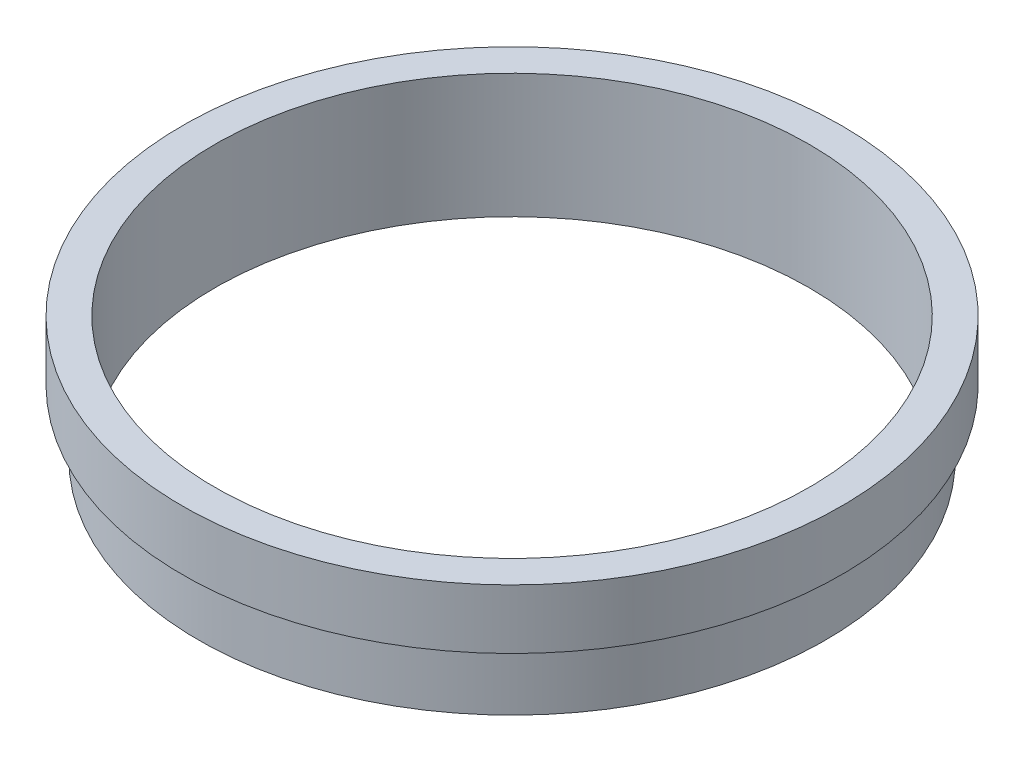
ISO-10303-21;
HEADER;
FILE_DESCRIPTION(('STEP AP214'),'2;1');
FILE_NAME('part.step','',(''),(''),'','','');
FILE_SCHEMA(('AUTOMOTIVE_DESIGN { 1 0 10303 214 1 1 1 1 }'));
ENDSEC;
DATA;
#1=APPLICATION_CONTEXT('core data for automotive mechanical design processes');
#2=APPLICATION_PROTOCOL_DEFINITION('international standard','automotive_design',2000,#1);
#3=PRODUCT_CONTEXT('',#1,'mechanical');
#4=PRODUCT('Part','Part','',(#3));
#5=PRODUCT_RELATED_PRODUCT_CATEGORY('part','',(#4));
#6=PRODUCT_DEFINITION_FORMATION('','',#4);
#7=PRODUCT_DEFINITION_CONTEXT('part definition',#1,'design');
#8=PRODUCT_DEFINITION('design','',#6,#7);
#9=PRODUCT_DEFINITION_SHAPE('','',#8);
#10=(LENGTH_UNIT() NAMED_UNIT(*) SI_UNIT(.MILLI.,.METRE.));
#11=(NAMED_UNIT(*) PLANE_ANGLE_UNIT() SI_UNIT($,.RADIAN.));
#12=(NAMED_UNIT(*) SI_UNIT($,.STERADIAN.) SOLID_ANGLE_UNIT());
#13=UNCERTAINTY_MEASURE_WITH_UNIT(LENGTH_MEASURE(1.E-05),#10,'distance_accuracy_value','');
#14=(GEOMETRIC_REPRESENTATION_CONTEXT(3) GLOBAL_UNCERTAINTY_ASSIGNED_CONTEXT((#13)) GLOBAL_UNIT_ASSIGNED_CONTEXT((#10,
#11,#12)) REPRESENTATION_CONTEXT('',''));
#15=CARTESIAN_POINT('',(0.,0.,0.));
#16=DIRECTION('',(0.,0.,1.));
#17=DIRECTION('',(1.,0.,0.));
#18=AXIS2_PLACEMENT_3D('',#15,#16,#17);
#19=CARTESIAN_POINT('',(0.,0.,0.));
#20=DIRECTION('',(0.,-1.,0.));
#21=DIRECTION('',(0.,0.,-1.));
#22=AXIS2_PLACEMENT_3D('',#19,#20,#21);
#23=PLANE('',#22);
#24=CARTESIAN_POINT('',(0.,0.,0.));
#25=DIRECTION('',(0.,-1.,0.));
#26=DIRECTION('',(0.,0.,-1.));
#27=AXIS2_PLACEMENT_3D('',#24,#25,#26);
#28=CIRCLE('',#27,29.);
#29=CARTESIAN_POINT('',(0.,0.,-29.));
#30=VERTEX_POINT('',#29);
#31=EDGE_CURVE('E10',#30,#30,#28,.T.);
#32=ORIENTED_EDGE('',*,*,#31,.T.);
#33=EDGE_LOOP('',(#32));
#34=FACE_BOUND('',#33,.T.);
#35=CARTESIAN_POINT('',(0.,0.,0.));
#36=DIRECTION('',(0.,-1.,0.));
#37=DIRECTION('',(0.,0.,-1.));
#38=AXIS2_PLACEMENT_3D('',#35,#36,#37);
#39=CIRCLE('',#38,27.5);
#40=CARTESIAN_POINT('',(0.,0.,-27.5));
#41=VERTEX_POINT('',#40);
#42=EDGE_CURVE('E55',#41,#41,#39,.T.);
#43=ORIENTED_EDGE('',*,*,#42,.F.);
#44=EDGE_LOOP('',(#43));
#45=FACE_BOUND('',#44,.T.);
#46=ADVANCED_FACE('F33',(#34,#45),#23,.T.);
#47=CARTESIAN_POINT('',(0.,0.,0.));
#48=DIRECTION('',(0.,-1.,0.));
#49=DIRECTION('',(0.,0.,-1.));
#50=AXIS2_PLACEMENT_3D('',#47,#48,#49);
#51=CYLINDRICAL_SURFACE('',#50,29.);
#52=CARTESIAN_POINT('',(0.,6.,0.));
#53=DIRECTION('',(0.,-1.,0.));
#54=DIRECTION('',(0.,0.,-1.));
#55=AXIS2_PLACEMENT_3D('',#52,#53,#54);
#56=CIRCLE('',#55,29.);
#57=CARTESIAN_POINT('',(0.,6.,-29.));
#58=VERTEX_POINT('',#57);
#59=EDGE_CURVE('E39',#58,#58,#56,.T.);
#60=ORIENTED_EDGE('',*,*,#59,.T.);
#61=EDGE_LOOP('',(#60));
#62=FACE_BOUND('',#61,.T.);
#63=ORIENTED_EDGE('',*,*,#31,.F.);
#64=EDGE_LOOP('',(#63));
#65=FACE_BOUND('',#64,.T.);
#66=ADVANCED_FACE('F62',(#62,#65),#51,.T.);
#67=CARTESIAN_POINT('',(0.,6.,0.));
#68=DIRECTION('',(0.,-1.,0.));
#69=DIRECTION('',(0.,0.,-1.));
#70=AXIS2_PLACEMENT_3D('',#67,#68,#69);
#71=PLANE('',#70);
#72=CARTESIAN_POINT('',(0.,6.,0.));
#73=DIRECTION('',(0.,-1.,0.));
#74=DIRECTION('',(0.,0.,-1.));
#75=AXIS2_PLACEMENT_3D('',#72,#73,#74);
#76=CIRCLE('',#75,30.5);
#77=CARTESIAN_POINT('',(0.,6.,-30.5));
#78=VERTEX_POINT('',#77);
#79=EDGE_CURVE('E43',#78,#78,#76,.T.);
#80=ORIENTED_EDGE('',*,*,#79,.T.);
#81=EDGE_LOOP('',(#80));
#82=FACE_BOUND('',#81,.T.);
#83=ORIENTED_EDGE('',*,*,#59,.F.);
#84=EDGE_LOOP('',(#83));
#85=FACE_BOUND('',#84,.T.);
#86=ADVANCED_FACE('F66',(#82,#85),#71,.T.);
#87=CARTESIAN_POINT('',(0.,0.,0.));
#88=DIRECTION('',(0.,-1.,0.));
#89=DIRECTION('',(0.,0.,-1.));
#90=AXIS2_PLACEMENT_3D('',#87,#88,#89);
#91=CYLINDRICAL_SURFACE('',#90,30.5);
#92=ORIENTED_EDGE('',*,*,#79,.F.);
#93=EDGE_LOOP('',(#92));
#94=FACE_BOUND('',#93,.T.);
#95=CARTESIAN_POINT('',(0.,11.5,0.));
#96=DIRECTION('',(0.,-1.,0.));
#97=DIRECTION('',(0.,0.,-1.));
#98=AXIS2_PLACEMENT_3D('',#95,#96,#97);
#99=CIRCLE('',#98,30.5);
#100=CARTESIAN_POINT('',(0.,11.5,-30.5));
#101=VERTEX_POINT('',#100);
#102=EDGE_CURVE('E47',#101,#101,#99,.T.);
#103=ORIENTED_EDGE('',*,*,#102,.T.);
#104=EDGE_LOOP('',(#103));
#105=FACE_BOUND('',#104,.T.);
#106=ADVANCED_FACE('F70',(#94,#105),#91,.T.);
#107=CARTESIAN_POINT('',(0.,11.5,0.));
#108=DIRECTION('',(0.,-1.,0.));
#109=DIRECTION('',(0.,0.,-1.));
#110=AXIS2_PLACEMENT_3D('',#107,#108,#109);
#111=PLANE('',#110);
#112=ORIENTED_EDGE('',*,*,#102,.F.);
#113=EDGE_LOOP('',(#112));
#114=FACE_BOUND('',#113,.T.);
#115=CARTESIAN_POINT('',(0.,11.5,0.));
#116=DIRECTION('',(0.,-1.,0.));
#117=DIRECTION('',(0.,0.,-1.));
#118=AXIS2_PLACEMENT_3D('',#115,#116,#117);
#119=CIRCLE('',#118,27.5);
#120=CARTESIAN_POINT('',(0.,11.5,-27.5));
#121=VERTEX_POINT('',#120);
#122=EDGE_CURVE('E52',#121,#121,#119,.T.);
#123=ORIENTED_EDGE('',*,*,#122,.T.);
#124=EDGE_LOOP('',(#123));
#125=FACE_BOUND('',#124,.T.);
#126=ADVANCED_FACE('F77',(#114,#125),#111,.F.);
#127=CARTESIAN_POINT('',(0.,0.,0.));
#128=DIRECTION('',(0.,-1.,0.));
#129=DIRECTION('',(0.,0.,-1.));
#130=AXIS2_PLACEMENT_3D('',#127,#128,#129);
#131=CYLINDRICAL_SURFACE('',#130,27.5);
#132=ORIENTED_EDGE('',*,*,#122,.F.);
#133=EDGE_LOOP('',(#132));
#134=FACE_BOUND('',#133,.T.);
#135=ORIENTED_EDGE('',*,*,#42,.T.);
#136=EDGE_LOOP('',(#135));
#137=FACE_BOUND('',#136,.T.);
#138=ADVANCED_FACE('F59',(#134,#137),#131,.F.);
#139=CLOSED_SHELL('',(#46,#66,#86,#106,#126,#138));
#140=MANIFOLD_SOLID_BREP('B2',#139);
#141=ADVANCED_BREP_SHAPE_REPRESENTATION('',(#18,#140),#14);
#142=SHAPE_DEFINITION_REPRESENTATION(#9,#141);
ENDSEC;
END-ISO-10303-21;
